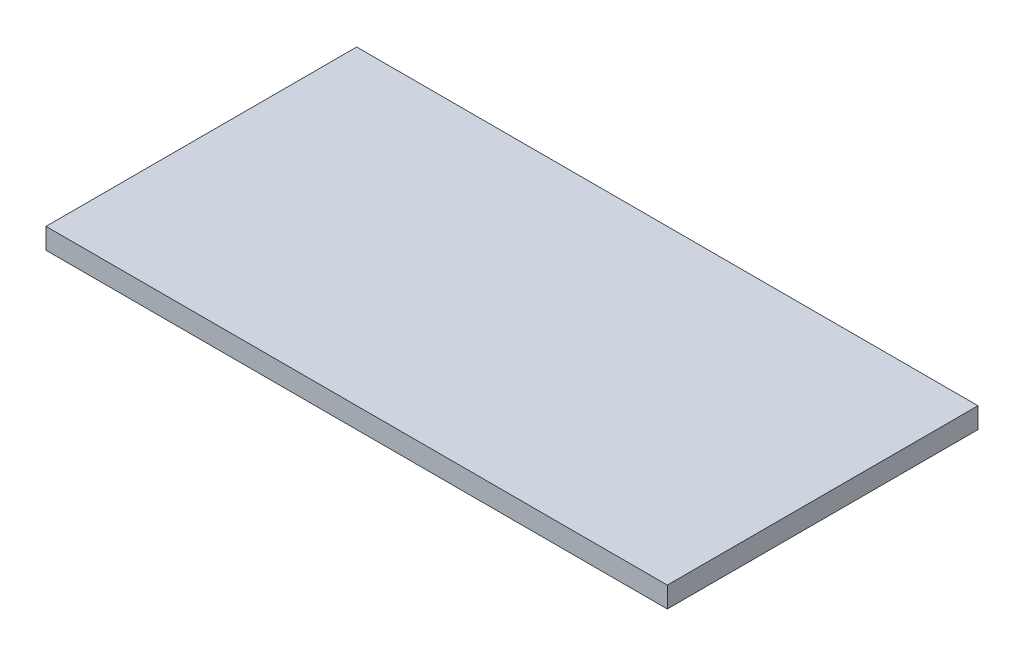
ISO-10303-21;
HEADER;
FILE_DESCRIPTION(('STEP AP214'),'2;1');
FILE_NAME('part.step','',(''),(''),'','','');
FILE_SCHEMA(('AUTOMOTIVE_DESIGN { 1 0 10303 214 1 1 1 1 }'));
ENDSEC;
DATA;
#1=APPLICATION_CONTEXT('core data for automotive mechanical design processes');
#2=APPLICATION_PROTOCOL_DEFINITION('international standard','automotive_design',2000,#1);
#3=PRODUCT_CONTEXT('',#1,'mechanical');
#4=PRODUCT('Part','Part','',(#3));
#5=PRODUCT_RELATED_PRODUCT_CATEGORY('part','',(#4));
#6=PRODUCT_DEFINITION_FORMATION('','',#4);
#7=PRODUCT_DEFINITION_CONTEXT('part definition',#1,'design');
#8=PRODUCT_DEFINITION('design','',#6,#7);
#9=PRODUCT_DEFINITION_SHAPE('','',#8);
#10=(LENGTH_UNIT() NAMED_UNIT(*) SI_UNIT(.MILLI.,.METRE.));
#11=(NAMED_UNIT(*) PLANE_ANGLE_UNIT() SI_UNIT($,.RADIAN.));
#12=(NAMED_UNIT(*) SI_UNIT($,.STERADIAN.) SOLID_ANGLE_UNIT());
#13=UNCERTAINTY_MEASURE_WITH_UNIT(LENGTH_MEASURE(1.E-05),#10,'distance_accuracy_value','');
#14=(GEOMETRIC_REPRESENTATION_CONTEXT(3) GLOBAL_UNCERTAINTY_ASSIGNED_CONTEXT((#13)) GLOBAL_UNIT_ASSIGNED_CONTEXT((#10,
#11,#12)) REPRESENTATION_CONTEXT('',''));
#15=CARTESIAN_POINT('',(0.,0.,0.));
#16=DIRECTION('',(0.,0.,1.));
#17=DIRECTION('',(1.,0.,0.));
#18=AXIS2_PLACEMENT_3D('',#15,#16,#17);
#19=CARTESIAN_POINT('',(0.,2.,0.));
#20=DIRECTION('',(1.,0.,0.));
#21=DIRECTION('',(0.,0.,-1.));
#22=AXIS2_PLACEMENT_3D('',#19,#20,#21);
#23=PLANE('',#22);
#24=DIRECTION('',(0.,0.,1.));
#25=VECTOR('',#24,1.);
#26=CARTESIAN_POINT('',(0.,0.,0.));
#27=LINE('',#26,#25);
#28=CARTESIAN_POINT('',(0.,0.,0.));
#29=VERTEX_POINT('',#28);
#30=CARTESIAN_POINT('',(0.,0.,30.));
#31=VERTEX_POINT('',#30);
#32=EDGE_CURVE('E105',#29,#31,#27,.T.);
#33=ORIENTED_EDGE('',*,*,#32,.T.);
#34=DIRECTION('',(0.,-1.,0.));
#35=VECTOR('',#34,1.);
#36=CARTESIAN_POINT('',(0.,2.,30.));
#37=LINE('',#36,#35);
#38=CARTESIAN_POINT('',(0.,2.,30.));
#39=VERTEX_POINT('',#38);
#40=EDGE_CURVE('E11',#39,#31,#37,.T.);
#41=ORIENTED_EDGE('',*,*,#40,.F.);
#42=DIRECTION('',(0.,0.,1.));
#43=VECTOR('',#42,1.);
#44=CARTESIAN_POINT('',(0.,2.,0.));
#45=LINE('',#44,#43);
#46=CARTESIAN_POINT('',(0.,2.,0.));
#47=VERTEX_POINT('',#46);
#48=EDGE_CURVE('E89',#47,#39,#45,.T.);
#49=ORIENTED_EDGE('',*,*,#48,.F.);
#50=DIRECTION('',(0.,-1.,0.));
#51=VECTOR('',#50,1.);
#52=CARTESIAN_POINT('',(0.,2.,0.));
#53=LINE('',#52,#51);
#54=EDGE_CURVE('E97',#47,#29,#53,.T.);
#55=ORIENTED_EDGE('',*,*,#54,.T.);
#56=EDGE_LOOP('',(#33,#41,#49,#55));
#57=FACE_BOUND('',#56,.T.);
#58=ADVANCED_FACE('F39',(#57),#23,.F.);
#59=CARTESIAN_POINT('',(0.,2.,30.));
#60=DIRECTION('',(0.,0.,-1.));
#61=DIRECTION('',(-1.,0.,0.));
#62=AXIS2_PLACEMENT_3D('',#59,#60,#61);
#63=PLANE('',#62);
#64=DIRECTION('',(1.,0.,0.));
#65=VECTOR('',#64,1.);
#66=CARTESIAN_POINT('',(0.,0.,30.));
#67=LINE('',#66,#65);
#68=CARTESIAN_POINT('',(60.,0.,30.));
#69=VERTEX_POINT('',#68);
#70=EDGE_CURVE('E92',#31,#69,#67,.T.);
#71=ORIENTED_EDGE('',*,*,#70,.T.);
#72=DIRECTION('',(0.,-1.,0.));
#73=VECTOR('',#72,1.);
#74=CARTESIAN_POINT('',(60.,2.,30.));
#75=LINE('',#74,#73);
#76=CARTESIAN_POINT('',(60.,2.,30.));
#77=VERTEX_POINT('',#76);
#78=EDGE_CURVE('E50',#77,#69,#75,.T.);
#79=ORIENTED_EDGE('',*,*,#78,.F.);
#80=DIRECTION('',(1.,0.,0.));
#81=VECTOR('',#80,1.);
#82=CARTESIAN_POINT('',(0.,2.,30.));
#83=LINE('',#82,#81);
#84=EDGE_CURVE('E82',#39,#77,#83,.T.);
#85=ORIENTED_EDGE('',*,*,#84,.F.);
#86=ORIENTED_EDGE('',*,*,#40,.T.);
#87=EDGE_LOOP('',(#71,#79,#85,#86));
#88=FACE_BOUND('',#87,.T.);
#89=ADVANCED_FACE('F93',(#88),#63,.F.);
#90=CARTESIAN_POINT('',(60.,2.,0.));
#91=DIRECTION('',(-1.,0.,0.));
#92=DIRECTION('',(0.,0.,1.));
#93=AXIS2_PLACEMENT_3D('',#90,#91,#92);
#94=PLANE('',#93);
#95=DIRECTION('',(0.,0.,-1.));
#96=VECTOR('',#95,1.);
#97=CARTESIAN_POINT('',(60.,0.,0.));
#98=LINE('',#97,#96);
#99=CARTESIAN_POINT('',(60.,0.,0.));
#100=VERTEX_POINT('',#99);
#101=EDGE_CURVE('E72',#69,#100,#98,.T.);
#102=ORIENTED_EDGE('',*,*,#101,.T.);
#103=DIRECTION('',(0.,-1.,0.));
#104=VECTOR('',#103,1.);
#105=CARTESIAN_POINT('',(60.,2.,0.));
#106=LINE('',#105,#104);
#107=CARTESIAN_POINT('',(60.,2.,0.));
#108=VERTEX_POINT('',#107);
#109=EDGE_CURVE('E94',#108,#100,#106,.T.);
#110=ORIENTED_EDGE('',*,*,#109,.F.);
#111=DIRECTION('',(0.,0.,-1.));
#112=VECTOR('',#111,1.);
#113=CARTESIAN_POINT('',(60.,2.,0.));
#114=LINE('',#113,#112);
#115=EDGE_CURVE('E88',#77,#108,#114,.T.);
#116=ORIENTED_EDGE('',*,*,#115,.F.);
#117=ORIENTED_EDGE('',*,*,#78,.T.);
#118=EDGE_LOOP('',(#102,#110,#116,#117));
#119=FACE_BOUND('',#118,.T.);
#120=ADVANCED_FACE('F96',(#119),#94,.F.);
#121=CARTESIAN_POINT('',(0.,2.,0.));
#122=DIRECTION('',(0.,0.,1.));
#123=DIRECTION('',(1.,0.,0.));
#124=AXIS2_PLACEMENT_3D('',#121,#122,#123);
#125=PLANE('',#124);
#126=DIRECTION('',(-1.,0.,0.));
#127=VECTOR('',#126,1.);
#128=CARTESIAN_POINT('',(0.,0.,0.));
#129=LINE('',#128,#127);
#130=EDGE_CURVE('E76',#100,#29,#129,.T.);
#131=ORIENTED_EDGE('',*,*,#130,.T.);
#132=ORIENTED_EDGE('',*,*,#54,.F.);
#133=DIRECTION('',(-1.,0.,0.));
#134=VECTOR('',#133,1.);
#135=CARTESIAN_POINT('',(0.,2.,0.));
#136=LINE('',#135,#134);
#137=EDGE_CURVE('E54',#108,#47,#136,.T.);
#138=ORIENTED_EDGE('',*,*,#137,.F.);
#139=ORIENTED_EDGE('',*,*,#109,.T.);
#140=EDGE_LOOP('',(#131,#132,#138,#139));
#141=FACE_BOUND('',#140,.T.);
#142=ADVANCED_FACE('F108',(#141),#125,.F.);
#143=CARTESIAN_POINT('',(0.,2.,0.));
#144=DIRECTION('',(0.,1.,0.));
#145=DIRECTION('',(0.,0.,1.));
#146=AXIS2_PLACEMENT_3D('',#143,#144,#145);
#147=PLANE('',#146);
#148=ORIENTED_EDGE('',*,*,#48,.T.);
#149=ORIENTED_EDGE('',*,*,#84,.T.);
#150=ORIENTED_EDGE('',*,*,#115,.T.);
#151=ORIENTED_EDGE('',*,*,#137,.T.);
#152=EDGE_LOOP('',(#148,#149,#150,#151));
#153=FACE_BOUND('',#152,.T.);
#154=ADVANCED_FACE('F86',(#153),#147,.T.);
#155=CARTESIAN_POINT('',(0.,0.,0.));
#156=DIRECTION('',(0.,1.,0.));
#157=DIRECTION('',(0.,0.,1.));
#158=AXIS2_PLACEMENT_3D('',#155,#156,#157);
#159=PLANE('',#158);
#160=ORIENTED_EDGE('',*,*,#32,.F.);
#161=ORIENTED_EDGE('',*,*,#130,.F.);
#162=ORIENTED_EDGE('',*,*,#101,.F.);
#163=ORIENTED_EDGE('',*,*,#70,.F.);
#164=EDGE_LOOP('',(#160,#161,#162,#163));
#165=FACE_BOUND('',#164,.T.);
#166=ADVANCED_FACE('F115',(#165),#159,.F.);
#167=CLOSED_SHELL('',(#58,#89,#120,#142,#154,#166));
#168=MANIFOLD_SOLID_BREP('B2',#167);
#169=ADVANCED_BREP_SHAPE_REPRESENTATION('',(#18,#168),#14);
#170=SHAPE_DEFINITION_REPRESENTATION(#9,#169);
ENDSEC;
END-ISO-10303-21;
